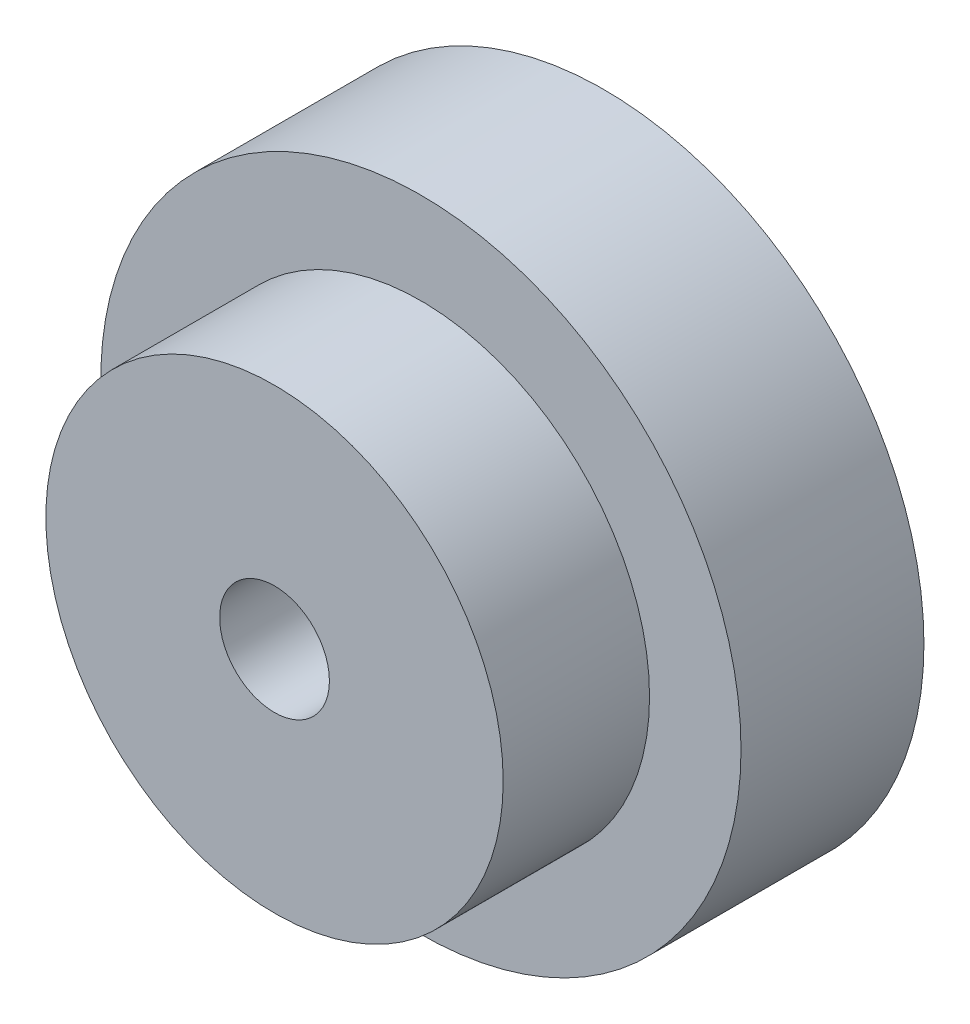
ISO-10303-21;
HEADER;
FILE_DESCRIPTION(('STEP AP214'),'2;1');
FILE_NAME('part.step','',(''),(''),'','','');
FILE_SCHEMA(('AUTOMOTIVE_DESIGN { 1 0 10303 214 1 1 1 1 }'));
ENDSEC;
DATA;
#1=APPLICATION_CONTEXT('core data for automotive mechanical design processes');
#2=APPLICATION_PROTOCOL_DEFINITION('international standard','automotive_design',2000,#1);
#3=PRODUCT_CONTEXT('',#1,'mechanical');
#4=PRODUCT('Part','Part','',(#3));
#5=PRODUCT_RELATED_PRODUCT_CATEGORY('part','',(#4));
#6=PRODUCT_DEFINITION_FORMATION('','',#4);
#7=PRODUCT_DEFINITION_CONTEXT('part definition',#1,'design');
#8=PRODUCT_DEFINITION('design','',#6,#7);
#9=PRODUCT_DEFINITION_SHAPE('','',#8);
#10=(LENGTH_UNIT() NAMED_UNIT(*) SI_UNIT(.MILLI.,.METRE.));
#11=(NAMED_UNIT(*) PLANE_ANGLE_UNIT() SI_UNIT($,.RADIAN.));
#12=(NAMED_UNIT(*) SI_UNIT($,.STERADIAN.) SOLID_ANGLE_UNIT());
#13=UNCERTAINTY_MEASURE_WITH_UNIT(LENGTH_MEASURE(1.E-05),#10,'distance_accuracy_value','');
#14=(GEOMETRIC_REPRESENTATION_CONTEXT(3) GLOBAL_UNCERTAINTY_ASSIGNED_CONTEXT((#13)) GLOBAL_UNIT_ASSIGNED_CONTEXT((#10,
#11,#12)) REPRESENTATION_CONTEXT('',''));
#15=CARTESIAN_POINT('',(0.,0.,0.));
#16=DIRECTION('',(0.,0.,1.));
#17=DIRECTION('',(1.,0.,0.));
#18=AXIS2_PLACEMENT_3D('',#15,#16,#17);
#19=CARTESIAN_POINT('',(0.,0.,10.));
#20=DIRECTION('',(0.,0.,1.));
#21=DIRECTION('',(1.,0.,0.));
#22=AXIS2_PLACEMENT_3D('',#19,#20,#21);
#23=PLANE('',#22);
#24=CARTESIAN_POINT('',(0.,0.,10.));
#25=DIRECTION('',(0.,0.,1.));
#26=DIRECTION('',(1.,0.,0.));
#27=AXIS2_PLACEMENT_3D('',#24,#25,#26);
#28=CIRCLE('',#27,12.5);
#29=CARTESIAN_POINT('',(12.5,0.,10.));
#30=VERTEX_POINT('',#29);
#31=EDGE_CURVE('E10',#30,#30,#28,.T.);
#32=ORIENTED_EDGE('',*,*,#31,.F.);
#33=EDGE_LOOP('',(#32));
#34=FACE_BOUND('',#33,.T.);
#35=CARTESIAN_POINT('',(0.,0.,10.));
#36=DIRECTION('',(0.,0.,1.));
#37=DIRECTION('',(1.,0.,0.));
#38=AXIS2_PLACEMENT_3D('',#35,#36,#37);
#39=CIRCLE('',#38,17.5);
#40=CARTESIAN_POINT('',(17.5,0.,10.));
#41=VERTEX_POINT('',#40);
#42=EDGE_CURVE('E40',#41,#41,#39,.T.);
#43=ORIENTED_EDGE('',*,*,#42,.T.);
#44=EDGE_LOOP('',(#43));
#45=FACE_BOUND('',#44,.T.);
#46=ADVANCED_FACE('F32',(#34,#45),#23,.T.);
#47=CARTESIAN_POINT('',(0.,0.,0.));
#48=DIRECTION('',(0.,0.,1.));
#49=DIRECTION('',(1.,0.,0.));
#50=AXIS2_PLACEMENT_3D('',#47,#48,#49);
#51=PLANE('',#50);
#52=CARTESIAN_POINT('',(0.,0.,0.));
#53=DIRECTION('',(0.,0.,1.));
#54=DIRECTION('',(1.,0.,0.));
#55=AXIS2_PLACEMENT_3D('',#52,#53,#54);
#56=CIRCLE('',#55,17.5);
#57=CARTESIAN_POINT('',(17.5,0.,0.));
#58=VERTEX_POINT('',#57);
#59=EDGE_CURVE('E36',#58,#58,#56,.T.);
#60=ORIENTED_EDGE('',*,*,#59,.F.);
#61=EDGE_LOOP('',(#60));
#62=FACE_BOUND('',#61,.T.);
#63=CARTESIAN_POINT('',(0.,0.,0.));
#64=DIRECTION('',(0.,0.,1.));
#65=DIRECTION('',(1.,0.,0.));
#66=AXIS2_PLACEMENT_3D('',#63,#64,#65);
#67=CIRCLE('',#66,3.);
#68=CARTESIAN_POINT('',(3.,0.,0.));
#69=VERTEX_POINT('',#68);
#70=EDGE_CURVE('E49',#69,#69,#67,.T.);
#71=ORIENTED_EDGE('',*,*,#70,.T.);
#72=EDGE_LOOP('',(#71));
#73=FACE_BOUND('',#72,.T.);
#74=ADVANCED_FACE('F76',(#62,#73),#51,.F.);
#75=CARTESIAN_POINT('',(0.,0.,10.));
#76=DIRECTION('',(0.,0.,-1.));
#77=DIRECTION('',(-1.,0.,0.));
#78=AXIS2_PLACEMENT_3D('',#75,#76,#77);
#79=CYLINDRICAL_SURFACE('',#78,17.5);
#80=ORIENTED_EDGE('',*,*,#42,.F.);
#81=EDGE_LOOP('',(#80));
#82=FACE_BOUND('',#81,.T.);
#83=ORIENTED_EDGE('',*,*,#59,.T.);
#84=EDGE_LOOP('',(#83));
#85=FACE_BOUND('',#84,.T.);
#86=ADVANCED_FACE('F34',(#82,#85),#79,.T.);
#87=CARTESIAN_POINT('',(0.,0.,10.));
#88=DIRECTION('',(0.,0.,-1.));
#89=DIRECTION('',(-1.,0.,0.));
#90=AXIS2_PLACEMENT_3D('',#87,#88,#89);
#91=CYLINDRICAL_SURFACE('',#90,3.);
#92=ORIENTED_EDGE('',*,*,#70,.F.);
#93=EDGE_LOOP('',(#92));
#94=FACE_BOUND('',#93,.T.);
#95=CARTESIAN_POINT('',(0.,0.,18.));
#96=DIRECTION('',(0.,0.,1.));
#97=DIRECTION('',(1.,0.,0.));
#98=AXIS2_PLACEMENT_3D('',#95,#96,#97);
#99=CIRCLE('',#98,3.);
#100=CARTESIAN_POINT('',(3.,0.,18.));
#101=VERTEX_POINT('',#100);
#102=EDGE_CURVE('E55',#101,#101,#99,.T.);
#103=ORIENTED_EDGE('',*,*,#102,.T.);
#104=EDGE_LOOP('',(#103));
#105=FACE_BOUND('',#104,.T.);
#106=ADVANCED_FACE('F61',(#94,#105),#91,.F.);
#107=CARTESIAN_POINT('',(0.,0.,18.));
#108=DIRECTION('',(0.,0.,1.));
#109=DIRECTION('',(1.,0.,0.));
#110=AXIS2_PLACEMENT_3D('',#107,#108,#109);
#111=PLANE('',#110);
#112=CARTESIAN_POINT('',(0.,0.,18.));
#113=DIRECTION('',(0.,0.,1.));
#114=DIRECTION('',(1.,0.,0.));
#115=AXIS2_PLACEMENT_3D('',#112,#113,#114);
#116=CIRCLE('',#115,12.5);
#117=CARTESIAN_POINT('',(12.5,0.,18.));
#118=VERTEX_POINT('',#117);
#119=EDGE_CURVE('E47',#118,#118,#116,.T.);
#120=ORIENTED_EDGE('',*,*,#119,.T.);
#121=EDGE_LOOP('',(#120));
#122=FACE_BOUND('',#121,.T.);
#123=ORIENTED_EDGE('',*,*,#102,.F.);
#124=EDGE_LOOP('',(#123));
#125=FACE_BOUND('',#124,.T.);
#126=ADVANCED_FACE('F63',(#122,#125),#111,.T.);
#127=CARTESIAN_POINT('',(0.,0.,18.));
#128=DIRECTION('',(0.,0.,-1.));
#129=DIRECTION('',(-1.,0.,0.));
#130=AXIS2_PLACEMENT_3D('',#127,#128,#129);
#131=CYLINDRICAL_SURFACE('',#130,12.5);
#132=ORIENTED_EDGE('',*,*,#119,.F.);
#133=EDGE_LOOP('',(#132));
#134=FACE_BOUND('',#133,.T.);
#135=ORIENTED_EDGE('',*,*,#31,.T.);
#136=EDGE_LOOP('',(#135));
#137=FACE_BOUND('',#136,.T.);
#138=ADVANCED_FACE('F65',(#134,#137),#131,.T.);
#139=CLOSED_SHELL('',(#46,#74,#86,#106,#126,#138));
#140=MANIFOLD_SOLID_BREP('B2',#139);
#141=ADVANCED_BREP_SHAPE_REPRESENTATION('',(#18,#140),#14);
#142=SHAPE_DEFINITION_REPRESENTATION(#9,#141);
ENDSEC;
END-ISO-10303-21;
